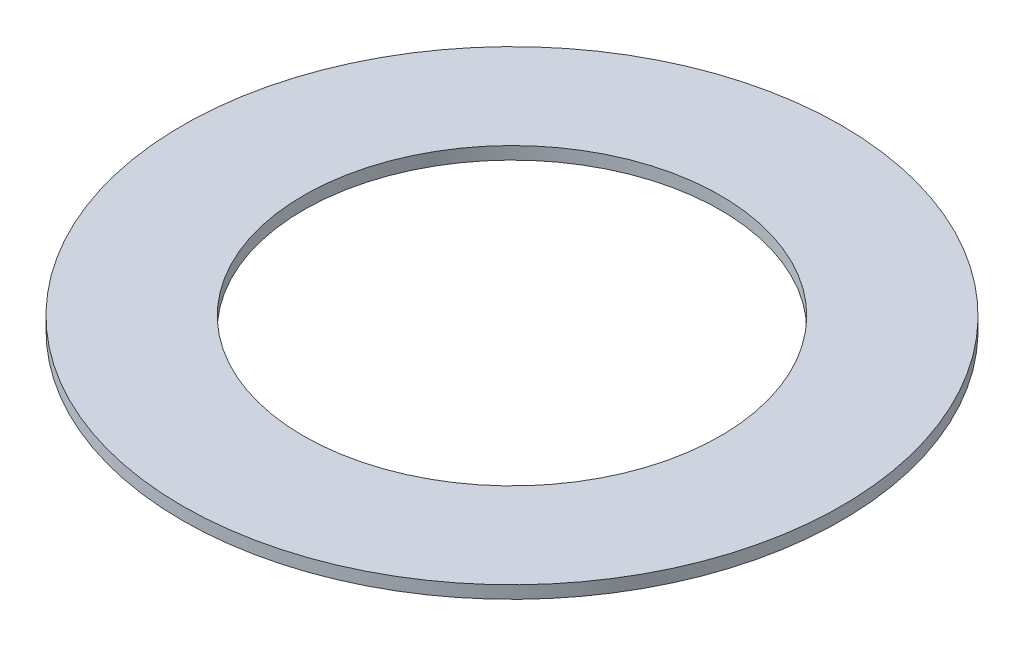
ISO-10303-21;
HEADER;
FILE_DESCRIPTION(('STEP AP214'),'2;1');
FILE_NAME('part.step','',(''),(''),'','','');
FILE_SCHEMA(('AUTOMOTIVE_DESIGN { 1 0 10303 214 1 1 1 1 }'));
ENDSEC;
DATA;
#1=APPLICATION_CONTEXT('core data for automotive mechanical design processes');
#2=APPLICATION_PROTOCOL_DEFINITION('international standard','automotive_design',2000,#1);
#3=PRODUCT_CONTEXT('',#1,'mechanical');
#4=PRODUCT('Part','Part','',(#3));
#5=PRODUCT_RELATED_PRODUCT_CATEGORY('part','',(#4));
#6=PRODUCT_DEFINITION_FORMATION('','',#4);
#7=PRODUCT_DEFINITION_CONTEXT('part definition',#1,'design');
#8=PRODUCT_DEFINITION('design','',#6,#7);
#9=PRODUCT_DEFINITION_SHAPE('','',#8);
#10=(LENGTH_UNIT() NAMED_UNIT(*) SI_UNIT(.MILLI.,.METRE.));
#11=(NAMED_UNIT(*) PLANE_ANGLE_UNIT() SI_UNIT($,.RADIAN.));
#12=(NAMED_UNIT(*) SI_UNIT($,.STERADIAN.) SOLID_ANGLE_UNIT());
#13=UNCERTAINTY_MEASURE_WITH_UNIT(LENGTH_MEASURE(1.E-05),#10,'distance_accuracy_value','');
#14=(GEOMETRIC_REPRESENTATION_CONTEXT(3) GLOBAL_UNCERTAINTY_ASSIGNED_CONTEXT((#13)) GLOBAL_UNIT_ASSIGNED_CONTEXT((#10,
#11,#12)) REPRESENTATION_CONTEXT('',''));
#15=CARTESIAN_POINT('',(0.,0.,0.));
#16=DIRECTION('',(0.,0.,1.));
#17=DIRECTION('',(1.,0.,0.));
#18=AXIS2_PLACEMENT_3D('',#15,#16,#17);
#19=CARTESIAN_POINT('',(0.,3.,0.));
#20=DIRECTION('',(0.,1.,0.));
#21=DIRECTION('',(0.,0.,1.));
#22=AXIS2_PLACEMENT_3D('',#19,#20,#21);
#23=PLANE('',#22);
#24=CARTESIAN_POINT('',(0.,3.,0.));
#25=DIRECTION('',(0.,1.,0.));
#26=DIRECTION('',(0.,0.,1.));
#27=AXIS2_PLACEMENT_3D('',#24,#25,#26);
#28=CIRCLE('',#27,78.35);
#29=CARTESIAN_POINT('',(0.,3.,78.35));
#30=VERTEX_POINT('',#29);
#31=EDGE_CURVE('E10',#30,#30,#28,.T.);
#32=ORIENTED_EDGE('',*,*,#31,.T.);
#33=EDGE_LOOP('',(#32));
#34=FACE_BOUND('',#33,.T.);
#35=CARTESIAN_POINT('',(0.,3.,0.));
#36=DIRECTION('',(0.,1.,0.));
#37=DIRECTION('',(0.,0.,1.));
#38=AXIS2_PLACEMENT_3D('',#35,#36,#37);
#39=CIRCLE('',#38,49.55);
#40=CARTESIAN_POINT('',(0.,3.,49.55));
#41=VERTEX_POINT('',#40);
#42=EDGE_CURVE('E50',#41,#41,#39,.T.);
#43=ORIENTED_EDGE('',*,*,#42,.F.);
#44=EDGE_LOOP('',(#43));
#45=FACE_BOUND('',#44,.T.);
#46=ADVANCED_FACE('F37',(#34,#45),#23,.T.);
#47=CARTESIAN_POINT('',(0.,0.,0.));
#48=DIRECTION('',(0.,1.,0.));
#49=DIRECTION('',(0.,0.,1.));
#50=AXIS2_PLACEMENT_3D('',#47,#48,#49);
#51=PLANE('',#50);
#52=CARTESIAN_POINT('',(0.,0.,0.));
#53=DIRECTION('',(0.,1.,0.));
#54=DIRECTION('',(0.,0.,1.));
#55=AXIS2_PLACEMENT_3D('',#52,#53,#54);
#56=CIRCLE('',#55,78.35);
#57=CARTESIAN_POINT('',(0.,0.,78.35));
#58=VERTEX_POINT('',#57);
#59=EDGE_CURVE('E41',#58,#58,#56,.T.);
#60=ORIENTED_EDGE('',*,*,#59,.F.);
#61=EDGE_LOOP('',(#60));
#62=FACE_BOUND('',#61,.T.);
#63=CARTESIAN_POINT('',(0.,0.,0.));
#64=DIRECTION('',(0.,1.,0.));
#65=DIRECTION('',(0.,0.,1.));
#66=AXIS2_PLACEMENT_3D('',#63,#64,#65);
#67=CIRCLE('',#66,49.55);
#68=CARTESIAN_POINT('',(0.,0.,49.55));
#69=VERTEX_POINT('',#68);
#70=EDGE_CURVE('E52',#69,#69,#67,.T.);
#71=ORIENTED_EDGE('',*,*,#70,.T.);
#72=EDGE_LOOP('',(#71));
#73=FACE_BOUND('',#72,.T.);
#74=ADVANCED_FACE('F64',(#62,#73),#51,.F.);
#75=CARTESIAN_POINT('',(0.,3.,0.));
#76=DIRECTION('',(0.,-1.,0.));
#77=DIRECTION('',(0.,0.,-1.));
#78=AXIS2_PLACEMENT_3D('',#75,#76,#77);
#79=CYLINDRICAL_SURFACE('',#78,78.35);
#80=ORIENTED_EDGE('',*,*,#31,.F.);
#81=EDGE_LOOP('',(#80));
#82=FACE_BOUND('',#81,.T.);
#83=ORIENTED_EDGE('',*,*,#59,.T.);
#84=EDGE_LOOP('',(#83));
#85=FACE_BOUND('',#84,.T.);
#86=ADVANCED_FACE('F39',(#82,#85),#79,.T.);
#87=CARTESIAN_POINT('',(0.,3.,0.));
#88=DIRECTION('',(0.,-1.,0.));
#89=DIRECTION('',(0.,0.,-1.));
#90=AXIS2_PLACEMENT_3D('',#87,#88,#89);
#91=CYLINDRICAL_SURFACE('',#90,49.55);
#92=ORIENTED_EDGE('',*,*,#42,.T.);
#93=EDGE_LOOP('',(#92));
#94=FACE_BOUND('',#93,.T.);
#95=ORIENTED_EDGE('',*,*,#70,.F.);
#96=EDGE_LOOP('',(#95));
#97=FACE_BOUND('',#96,.T.);
#98=ADVANCED_FACE('F60',(#94,#97),#91,.F.);
#99=CLOSED_SHELL('',(#46,#74,#86,#98));
#100=MANIFOLD_SOLID_BREP('B2',#99);
#101=ADVANCED_BREP_SHAPE_REPRESENTATION('',(#18,#100),#14);
#102=SHAPE_DEFINITION_REPRESENTATION(#9,#101);
ENDSEC;
END-ISO-10303-21;
